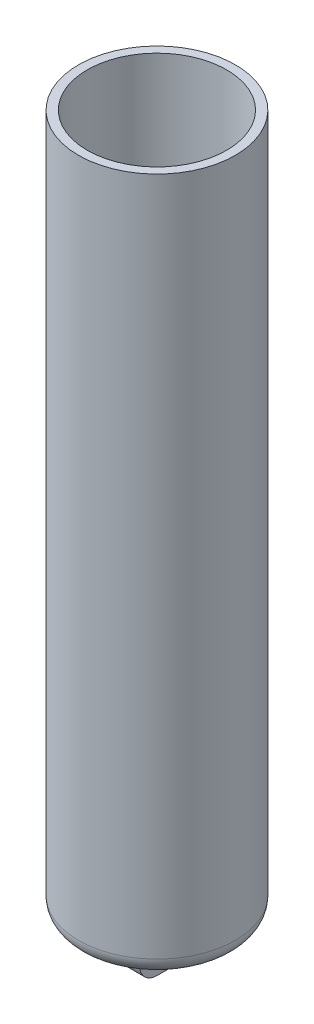
ISO-10303-21;
HEADER;
FILE_DESCRIPTION(('STEP AP214'),'2;1');
FILE_NAME('part.step','',(''),(''),'','','');
FILE_SCHEMA(('AUTOMOTIVE_DESIGN { 1 0 10303 214 1 1 1 1 }'));
ENDSEC;
DATA;
#1=APPLICATION_CONTEXT('core data for automotive mechanical design processes');
#2=APPLICATION_PROTOCOL_DEFINITION('international standard','automotive_design',2000,#1);
#3=PRODUCT_CONTEXT('',#1,'mechanical');
#4=PRODUCT('Part','Part','',(#3));
#5=PRODUCT_RELATED_PRODUCT_CATEGORY('part','',(#4));
#6=PRODUCT_DEFINITION_FORMATION('','',#4);
#7=PRODUCT_DEFINITION_CONTEXT('part definition',#1,'design');
#8=PRODUCT_DEFINITION('design','',#6,#7);
#9=PRODUCT_DEFINITION_SHAPE('','',#8);
#10=(LENGTH_UNIT() NAMED_UNIT(*) SI_UNIT(.MILLI.,.METRE.));
#11=(NAMED_UNIT(*) PLANE_ANGLE_UNIT() SI_UNIT($,.RADIAN.));
#12=(NAMED_UNIT(*) SI_UNIT($,.STERADIAN.) SOLID_ANGLE_UNIT());
#13=UNCERTAINTY_MEASURE_WITH_UNIT(LENGTH_MEASURE(1.E-05),#10,'distance_accuracy_value','');
#14=(GEOMETRIC_REPRESENTATION_CONTEXT(3) GLOBAL_UNCERTAINTY_ASSIGNED_CONTEXT((#13)) GLOBAL_UNIT_ASSIGNED_CONTEXT((#10,
#11,#12)) REPRESENTATION_CONTEXT('',''));
#15=CARTESIAN_POINT('',(0.,0.,0.));
#16=DIRECTION('',(0.,0.,1.));
#17=DIRECTION('',(1.,0.,0.));
#18=AXIS2_PLACEMENT_3D('',#15,#16,#17);
#19=CARTESIAN_POINT('',(0.,0.,0.));
#20=DIRECTION('',(0.,1.,0.));
#21=DIRECTION('',(0.,0.,1.));
#22=AXIS2_PLACEMENT_3D('',#19,#20,#21);
#23=PLANE('',#22);
#24=CARTESIAN_POINT('',(0.,0.,0.));
#25=DIRECTION('',(0.,1.,0.));
#26=DIRECTION('',(0.,0.,1.));
#27=AXIS2_PLACEMENT_3D('',#24,#25,#26);
#28=CIRCLE('',#27,7.);
#29=CARTESIAN_POINT('',(0.,0.,7.));
#30=VERTEX_POINT('',#29);
#31=EDGE_CURVE('E11',#30,#30,#28,.F.);
#32=ORIENTED_EDGE('',*,*,#31,.T.);
#33=EDGE_LOOP('',(#32));
#34=FACE_BOUND('',#33,.T.);
#35=DIRECTION('',(0.,0.,-1.));
#36=VECTOR('',#35,1.);
#37=CARTESIAN_POINT('',(-1.,0.,-3.));
#38=LINE('',#37,#36);
#39=CARTESIAN_POINT('',(-1.,0.,3.));
#40=VERTEX_POINT('',#39);
#41=CARTESIAN_POINT('',(-1.,0.,-3.));
#42=VERTEX_POINT('',#41);
#43=EDGE_CURVE('E119',#40,#42,#38,.T.);
#44=ORIENTED_EDGE('',*,*,#43,.F.);
#45=DIRECTION('',(-1.,0.,0.));
#46=VECTOR('',#45,1.);
#47=CARTESIAN_POINT('',(1.,0.,3.));
#48=LINE('',#47,#46);
#49=CARTESIAN_POINT('',(1.,0.,3.));
#50=VERTEX_POINT('',#49);
#51=EDGE_CURVE('E113',#50,#40,#48,.T.);
#52=ORIENTED_EDGE('',*,*,#51,.F.);
#53=DIRECTION('',(0.,0.,1.));
#54=VECTOR('',#53,1.);
#55=CARTESIAN_POINT('',(1.,0.,-3.));
#56=LINE('',#55,#54);
#57=CARTESIAN_POINT('',(1.,0.,-3.));
#58=VERTEX_POINT('',#57);
#59=EDGE_CURVE('E96',#58,#50,#56,.T.);
#60=ORIENTED_EDGE('',*,*,#59,.F.);
#61=DIRECTION('',(1.,0.,0.));
#62=VECTOR('',#61,1.);
#63=CARTESIAN_POINT('',(1.,0.,-3.));
#64=LINE('',#63,#62);
#65=EDGE_CURVE('E110',#42,#58,#64,.T.);
#66=ORIENTED_EDGE('',*,*,#65,.F.);
#67=EDGE_LOOP('',(#44,#52,#60,#66));
#68=FACE_BOUND('',#67,.T.);
#69=ADVANCED_FACE('F39',(#34,#68),#23,.F.);
#70=CARTESIAN_POINT('',(0.,80.,0.));
#71=DIRECTION('',(0.,-1.,0.));
#72=DIRECTION('',(0.,0.,-1.));
#73=AXIS2_PLACEMENT_3D('',#70,#71,#72);
#74=CYLINDRICAL_SURFACE('',#73,9.);
#75=CARTESIAN_POINT('',(0.,2.,0.));
#76=DIRECTION('',(0.,1.,0.));
#77=DIRECTION('',(0.,0.,1.));
#78=AXIS2_PLACEMENT_3D('',#75,#76,#77);
#79=CIRCLE('',#78,9.);
#80=CARTESIAN_POINT('',(0.,2.,9.));
#81=VERTEX_POINT('',#80);
#82=EDGE_CURVE('E48',#81,#81,#79,.T.);
#83=ORIENTED_EDGE('',*,*,#82,.T.);
#84=EDGE_LOOP('',(#83));
#85=FACE_BOUND('',#84,.T.);
#86=CARTESIAN_POINT('',(0.,80.,0.));
#87=DIRECTION('',(0.,1.,0.));
#88=DIRECTION('',(0.,0.,1.));
#89=AXIS2_PLACEMENT_3D('',#86,#87,#88);
#90=CIRCLE('',#89,9.);
#91=CARTESIAN_POINT('',(0.,80.,9.));
#92=VERTEX_POINT('',#91);
#93=EDGE_CURVE('E142',#92,#92,#90,.T.);
#94=ORIENTED_EDGE('',*,*,#93,.F.);
#95=EDGE_LOOP('',(#94));
#96=FACE_BOUND('',#95,.T.);
#97=ADVANCED_FACE('F176',(#85,#96),#74,.T.);
#98=CARTESIAN_POINT('',(0.,80.,0.));
#99=DIRECTION('',(0.,1.,0.));
#100=DIRECTION('',(0.,0.,1.));
#101=AXIS2_PLACEMENT_3D('',#98,#99,#100);
#102=PLANE('',#101);
#103=CARTESIAN_POINT('',(0.,80.,0.));
#104=DIRECTION('',(0.,1.,0.));
#105=DIRECTION('',(0.,0.,1.));
#106=AXIS2_PLACEMENT_3D('',#103,#104,#105);
#107=CIRCLE('',#106,8.);
#108=CARTESIAN_POINT('',(0.,80.,8.));
#109=VERTEX_POINT('',#108);
#110=EDGE_CURVE('E137',#109,#109,#107,.T.);
#111=ORIENTED_EDGE('',*,*,#110,.F.);
#112=EDGE_LOOP('',(#111));
#113=FACE_BOUND('',#112,.T.);
#114=ORIENTED_EDGE('',*,*,#93,.T.);
#115=EDGE_LOOP('',(#114));
#116=FACE_BOUND('',#115,.T.);
#117=ADVANCED_FACE('F194',(#113,#116),#102,.T.);
#118=CARTESIAN_POINT('',(0.,3.,0.));
#119=DIRECTION('',(0.,1.,0.));
#120=DIRECTION('',(0.,0.,1.));
#121=AXIS2_PLACEMENT_3D('',#118,#119,#120);
#122=CYLINDRICAL_SURFACE('',#121,8.);
#123=CARTESIAN_POINT('',(0.,3.,0.));
#124=DIRECTION('',(0.,1.,0.));
#125=DIRECTION('',(0.,0.,1.));
#126=AXIS2_PLACEMENT_3D('',#123,#124,#125);
#127=CIRCLE('',#126,8.);
#128=CARTESIAN_POINT('',(0.,3.,8.));
#129=VERTEX_POINT('',#128);
#130=EDGE_CURVE('E138',#129,#129,#127,.T.);
#131=ORIENTED_EDGE('',*,*,#130,.F.);
#132=EDGE_LOOP('',(#131));
#133=FACE_BOUND('',#132,.T.);
#134=ORIENTED_EDGE('',*,*,#110,.T.);
#135=EDGE_LOOP('',(#134));
#136=FACE_BOUND('',#135,.T.);
#137=ADVANCED_FACE('F244',(#133,#136),#122,.F.);
#138=CARTESIAN_POINT('',(0.,3.,0.));
#139=DIRECTION('',(0.,1.,0.));
#140=DIRECTION('',(0.,0.,1.));
#141=AXIS2_PLACEMENT_3D('',#138,#139,#140);
#142=PLANE('',#141);
#143=ORIENTED_EDGE('',*,*,#130,.T.);
#144=EDGE_LOOP('',(#143));
#145=FACE_BOUND('',#144,.T.);
#146=ADVANCED_FACE('F241',(#145),#142,.T.);
#147=CARTESIAN_POINT('',(-1.,-5.,-3.));
#148=DIRECTION('',(1.,0.,0.));
#149=DIRECTION('',(0.,0.,-1.));
#150=AXIS2_PLACEMENT_3D('',#147,#148,#149);
#151=PLANE('',#150);
#152=CARTESIAN_POINT('',(-1.,-2.51555166340722,0.));
#153=DIRECTION('',(1.,0.,0.));
#154=DIRECTION('',(0.,0.,-1.));
#155=AXIS2_PLACEMENT_3D('',#152,#153,#154);
#156=CIRCLE('',#155,1.25);
#157=CARTESIAN_POINT('',(-1.,-2.51555166340722,-1.25));
#158=VERTEX_POINT('',#157);
#159=EDGE_CURVE('E122',#158,#158,#156,.T.);
#160=ORIENTED_EDGE('',*,*,#159,.T.);
#161=EDGE_LOOP('',(#160));
#162=FACE_BOUND('',#161,.T.);
#163=DIRECTION('',(0.,0.,-1.));
#164=VECTOR('',#163,1.);
#165=CARTESIAN_POINT('',(-1.,-5.,-3.));
#166=LINE('',#165,#164);
#167=CARTESIAN_POINT('',(-1.,-5.,1.));
#168=VERTEX_POINT('',#167);
#169=CARTESIAN_POINT('',(-1.,-5.,-1.));
#170=VERTEX_POINT('',#169);
#171=EDGE_CURVE('E128',#168,#170,#166,.T.);
#172=ORIENTED_EDGE('',*,*,#171,.F.);
#173=CARTESIAN_POINT('',(-1.,-3.,1.));
#174=DIRECTION('',(1.,0.,0.));
#175=DIRECTION('',(0.,0.,-1.));
#176=AXIS2_PLACEMENT_3D('',#173,#174,#175);
#177=CIRCLE('',#176,2.);
#178=CARTESIAN_POINT('',(-1.,-3.,3.));
#179=VERTEX_POINT('',#178);
#180=EDGE_CURVE('E63',#168,#179,#177,.F.);
#181=ORIENTED_EDGE('',*,*,#180,.T.);
#182=DIRECTION('',(0.,1.,0.));
#183=VECTOR('',#182,1.);
#184=CARTESIAN_POINT('',(-1.,-5.,3.));
#185=LINE('',#184,#183);
#186=EDGE_CURVE('E129',#179,#40,#185,.T.);
#187=ORIENTED_EDGE('',*,*,#186,.T.);
#188=ORIENTED_EDGE('',*,*,#43,.T.);
#189=DIRECTION('',(0.,1.,0.));
#190=VECTOR('',#189,1.);
#191=CARTESIAN_POINT('',(-1.,-5.,-3.));
#192=LINE('',#191,#190);
#193=CARTESIAN_POINT('',(-1.,-3.,-3.));
#194=VERTEX_POINT('',#193);
#195=EDGE_CURVE('E103',#194,#42,#192,.T.);
#196=ORIENTED_EDGE('',*,*,#195,.F.);
#197=CARTESIAN_POINT('',(-1.,-3.,-1.));
#198=DIRECTION('',(1.,0.,0.));
#199=DIRECTION('',(0.,0.,-1.));
#200=AXIS2_PLACEMENT_3D('',#197,#198,#199);
#201=CIRCLE('',#200,2.);
#202=EDGE_CURVE('E158',#194,#170,#201,.F.);
#203=ORIENTED_EDGE('',*,*,#202,.T.);
#204=EDGE_LOOP('',(#172,#181,#187,#188,#196,#203));
#205=FACE_BOUND('',#204,.T.);
#206=ADVANCED_FACE('F210',(#162,#205),#151,.F.);
#207=CARTESIAN_POINT('',(1.,-5.,-3.));
#208=DIRECTION('',(0.,0.,1.));
#209=DIRECTION('',(1.,0.,0.));
#210=AXIS2_PLACEMENT_3D('',#207,#208,#209);
#211=PLANE('',#210);
#212=DIRECTION('',(0.,1.,0.));
#213=VECTOR('',#212,1.);
#214=CARTESIAN_POINT('',(1.,-5.,-3.));
#215=LINE('',#214,#213);
#216=CARTESIAN_POINT('',(1.,-3.,-3.));
#217=VERTEX_POINT('',#216);
#218=EDGE_CURVE('E93',#217,#58,#215,.T.);
#219=ORIENTED_EDGE('',*,*,#218,.F.);
#220=DIRECTION('',(1.,0.,0.));
#221=VECTOR('',#220,1.);
#222=CARTESIAN_POINT('',(-1.,-3.,-3.));
#223=LINE('',#222,#221);
#224=EDGE_CURVE('E155',#217,#194,#223,.F.);
#225=ORIENTED_EDGE('',*,*,#224,.T.);
#226=ORIENTED_EDGE('',*,*,#195,.T.);
#227=ORIENTED_EDGE('',*,*,#65,.T.);
#228=EDGE_LOOP('',(#219,#225,#226,#227));
#229=FACE_BOUND('',#228,.T.);
#230=ADVANCED_FACE('F116',(#229),#211,.F.);
#231=CARTESIAN_POINT('',(1.,-5.,-3.));
#232=DIRECTION('',(-1.,0.,0.));
#233=DIRECTION('',(0.,0.,1.));
#234=AXIS2_PLACEMENT_3D('',#231,#232,#233);
#235=PLANE('',#234);
#236=CARTESIAN_POINT('',(1.,-2.51555166340722,0.));
#237=DIRECTION('',(1.,0.,0.));
#238=DIRECTION('',(0.,0.,-1.));
#239=AXIS2_PLACEMENT_3D('',#236,#237,#238);
#240=CIRCLE('',#239,1.25);
#241=CARTESIAN_POINT('',(1.,-2.51555166340722,-1.25));
#242=VERTEX_POINT('',#241);
#243=EDGE_CURVE('E223',#242,#242,#240,.T.);
#244=ORIENTED_EDGE('',*,*,#243,.F.);
#245=EDGE_LOOP('',(#244));
#246=FACE_BOUND('',#245,.T.);
#247=DIRECTION('',(0.,1.,0.));
#248=VECTOR('',#247,1.);
#249=CARTESIAN_POINT('',(1.,-5.,3.));
#250=LINE('',#249,#248);
#251=CARTESIAN_POINT('',(1.,-3.,3.));
#252=VERTEX_POINT('',#251);
#253=EDGE_CURVE('E104',#252,#50,#250,.T.);
#254=ORIENTED_EDGE('',*,*,#253,.F.);
#255=CARTESIAN_POINT('',(1.,-3.,1.));
#256=DIRECTION('',(-1.,0.,0.));
#257=DIRECTION('',(0.,0.,1.));
#258=AXIS2_PLACEMENT_3D('',#255,#256,#257);
#259=CIRCLE('',#258,2.);
#260=CARTESIAN_POINT('',(1.,-5.,1.));
#261=VERTEX_POINT('',#260);
#262=EDGE_CURVE('E170',#252,#261,#259,.F.);
#263=ORIENTED_EDGE('',*,*,#262,.T.);
#264=DIRECTION('',(0.,0.,1.));
#265=VECTOR('',#264,1.);
#266=CARTESIAN_POINT('',(1.,-5.,-3.));
#267=LINE('',#266,#265);
#268=CARTESIAN_POINT('',(1.,-5.,-1.));
#269=VERTEX_POINT('',#268);
#270=EDGE_CURVE('E132',#269,#261,#267,.T.);
#271=ORIENTED_EDGE('',*,*,#270,.F.);
#272=CARTESIAN_POINT('',(1.,-3.,-1.));
#273=DIRECTION('',(-1.,0.,0.));
#274=DIRECTION('',(0.,0.,1.));
#275=AXIS2_PLACEMENT_3D('',#272,#273,#274);
#276=CIRCLE('',#275,2.);
#277=EDGE_CURVE('E98',#269,#217,#276,.F.);
#278=ORIENTED_EDGE('',*,*,#277,.T.);
#279=ORIENTED_EDGE('',*,*,#218,.T.);
#280=ORIENTED_EDGE('',*,*,#59,.T.);
#281=EDGE_LOOP('',(#254,#263,#271,#278,#279,#280));
#282=FACE_BOUND('',#281,.T.);
#283=ADVANCED_FACE('F95',(#246,#282),#235,.F.);
#284=CARTESIAN_POINT('',(1.,-5.,3.));
#285=DIRECTION('',(0.,0.,-1.));
#286=DIRECTION('',(-1.,0.,0.));
#287=AXIS2_PLACEMENT_3D('',#284,#285,#286);
#288=PLANE('',#287);
#289=ORIENTED_EDGE('',*,*,#186,.F.);
#290=DIRECTION('',(-1.,0.,0.));
#291=VECTOR('',#290,1.);
#292=CARTESIAN_POINT('',(1.,-3.,3.));
#293=LINE('',#292,#291);
#294=EDGE_CURVE('E55',#179,#252,#293,.F.);
#295=ORIENTED_EDGE('',*,*,#294,.T.);
#296=ORIENTED_EDGE('',*,*,#253,.T.);
#297=ORIENTED_EDGE('',*,*,#51,.T.);
#298=EDGE_LOOP('',(#289,#295,#296,#297));
#299=FACE_BOUND('',#298,.T.);
#300=ADVANCED_FACE('F211',(#299),#288,.F.);
#301=CARTESIAN_POINT('',(0.,-5.,0.));
#302=DIRECTION('',(0.,-1.,0.));
#303=DIRECTION('',(0.,0.,-1.));
#304=AXIS2_PLACEMENT_3D('',#301,#302,#303);
#305=PLANE('',#304);
#306=ORIENTED_EDGE('',*,*,#270,.T.);
#307=DIRECTION('',(-1.,0.,0.));
#308=VECTOR('',#307,1.);
#309=CARTESIAN_POINT('',(-1.,-5.,1.));
#310=LINE('',#309,#308);
#311=EDGE_CURVE('E162',#261,#168,#310,.T.);
#312=ORIENTED_EDGE('',*,*,#311,.T.);
#313=ORIENTED_EDGE('',*,*,#171,.T.);
#314=DIRECTION('',(1.,0.,0.));
#315=VECTOR('',#314,1.);
#316=CARTESIAN_POINT('',(1.,-5.,-1.));
#317=LINE('',#316,#315);
#318=EDGE_CURVE('E149',#170,#269,#317,.T.);
#319=ORIENTED_EDGE('',*,*,#318,.T.);
#320=EDGE_LOOP('',(#306,#312,#313,#319));
#321=FACE_BOUND('',#320,.T.);
#322=ADVANCED_FACE('F205',(#321),#305,.T.);
#323=CARTESIAN_POINT('',(-4.,-2.51555166340722,0.));
#324=DIRECTION('',(1.,0.,0.));
#325=DIRECTION('',(0.,0.,-1.));
#326=AXIS2_PLACEMENT_3D('',#323,#324,#325);
#327=CYLINDRICAL_SURFACE('',#326,1.25);
#328=ORIENTED_EDGE('',*,*,#243,.T.);
#329=EDGE_LOOP('',(#328));
#330=FACE_BOUND('',#329,.T.);
#331=ORIENTED_EDGE('',*,*,#159,.F.);
#332=EDGE_LOOP('',(#331));
#333=FACE_BOUND('',#332,.T.);
#334=ADVANCED_FACE('F200',(#330,#333),#327,.F.);
#335=CARTESIAN_POINT('',(0.,-3.,-1.));
#336=DIRECTION('',(-1.,0.,0.));
#337=DIRECTION('',(0.,0.,1.));
#338=AXIS2_PLACEMENT_3D('',#335,#336,#337);
#339=CYLINDRICAL_SURFACE('',#338,2.);
#340=ORIENTED_EDGE('',*,*,#202,.F.);
#341=ORIENTED_EDGE('',*,*,#224,.F.);
#342=ORIENTED_EDGE('',*,*,#277,.F.);
#343=ORIENTED_EDGE('',*,*,#318,.F.);
#344=EDGE_LOOP('',(#340,#341,#342,#343));
#345=FACE_BOUND('',#344,.T.);
#346=ADVANCED_FACE('F185',(#345),#339,.T.);
#347=CARTESIAN_POINT('',(0.,-3.,1.));
#348=DIRECTION('',(1.,0.,0.));
#349=DIRECTION('',(0.,0.,-1.));
#350=AXIS2_PLACEMENT_3D('',#347,#348,#349);
#351=CYLINDRICAL_SURFACE('',#350,2.);
#352=ORIENTED_EDGE('',*,*,#262,.F.);
#353=ORIENTED_EDGE('',*,*,#294,.F.);
#354=ORIENTED_EDGE('',*,*,#180,.F.);
#355=ORIENTED_EDGE('',*,*,#311,.F.);
#356=EDGE_LOOP('',(#352,#353,#354,#355));
#357=FACE_BOUND('',#356,.T.);
#358=ADVANCED_FACE('F180',(#357),#351,.T.);
#359=CARTESIAN_POINT('',(0.,2.,0.));
#360=DIRECTION('',(0.,1.,0.));
#361=DIRECTION('',(0.,0.,1.));
#362=AXIS2_PLACEMENT_3D('',#359,#360,#361);
#363=TOROIDAL_SURFACE('',#362,7.,2.);
#364=ORIENTED_EDGE('',*,*,#31,.F.);
#365=EDGE_LOOP('',(#364));
#366=FACE_BOUND('',#365,.T.);
#367=ORIENTED_EDGE('',*,*,#82,.F.);
#368=EDGE_LOOP('',(#367));
#369=FACE_BOUND('',#368,.T.);
#370=ADVANCED_FACE('F41',(#366,#369),#363,.T.);
#371=CLOSED_SHELL('',(#69,#97,#117,#137,#146,#206,#230,#283,#300,#322,#334,#346,#358,#370));
#372=MANIFOLD_SOLID_BREP('B2',#371);
#373=ADVANCED_BREP_SHAPE_REPRESENTATION('',(#18,#372),#14);
#374=SHAPE_DEFINITION_REPRESENTATION(#9,#373);
ENDSEC;
END-ISO-10303-21;
